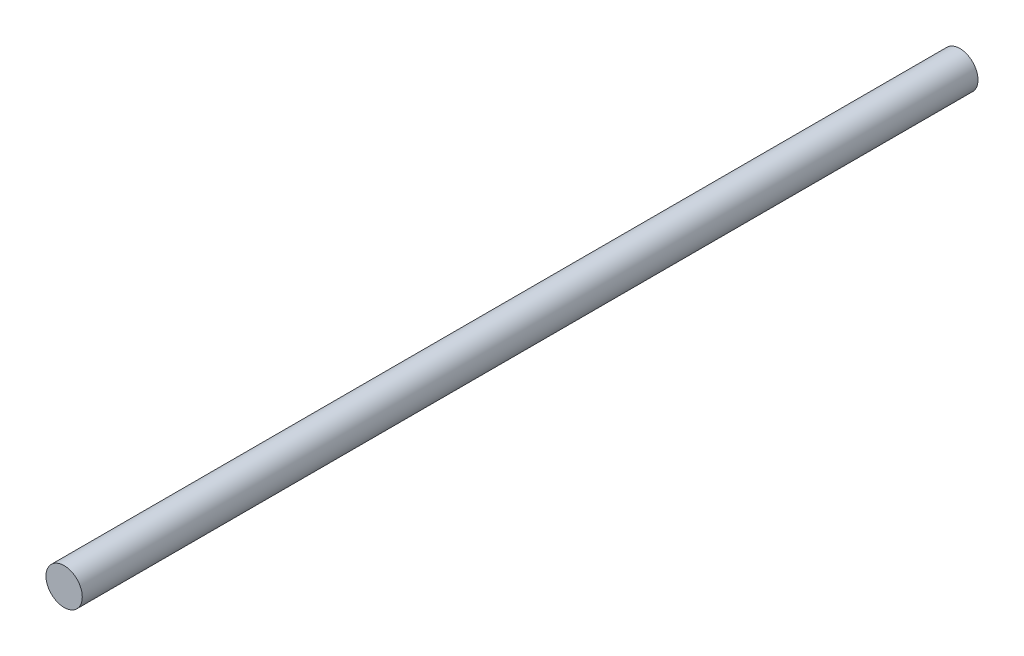
ISO-10303-21;
HEADER;
FILE_DESCRIPTION(('STEP AP214'),'2;1');
FILE_NAME('part.step','',(''),(''),'','','');
FILE_SCHEMA(('AUTOMOTIVE_DESIGN { 1 0 10303 214 1 1 1 1 }'));
ENDSEC;
DATA;
#1=APPLICATION_CONTEXT('core data for automotive mechanical design processes');
#2=APPLICATION_PROTOCOL_DEFINITION('international standard','automotive_design',2000,#1);
#3=PRODUCT_CONTEXT('',#1,'mechanical');
#4=PRODUCT('Part','Part','',(#3));
#5=PRODUCT_RELATED_PRODUCT_CATEGORY('part','',(#4));
#6=PRODUCT_DEFINITION_FORMATION('','',#4);
#7=PRODUCT_DEFINITION_CONTEXT('part definition',#1,'design');
#8=PRODUCT_DEFINITION('design','',#6,#7);
#9=PRODUCT_DEFINITION_SHAPE('','',#8);
#10=(LENGTH_UNIT() NAMED_UNIT(*) SI_UNIT(.MILLI.,.METRE.));
#11=(NAMED_UNIT(*) PLANE_ANGLE_UNIT() SI_UNIT($,.RADIAN.));
#12=(NAMED_UNIT(*) SI_UNIT($,.STERADIAN.) SOLID_ANGLE_UNIT());
#13=UNCERTAINTY_MEASURE_WITH_UNIT(LENGTH_MEASURE(1.E-05),#10,'distance_accuracy_value','');
#14=(GEOMETRIC_REPRESENTATION_CONTEXT(3) GLOBAL_UNCERTAINTY_ASSIGNED_CONTEXT((#13)) GLOBAL_UNIT_ASSIGNED_CONTEXT((#10,
#11,#12)) REPRESENTATION_CONTEXT('',''));
#15=CARTESIAN_POINT('',(0.,0.,0.));
#16=DIRECTION('',(0.,0.,1.));
#17=DIRECTION('',(1.,0.,0.));
#18=AXIS2_PLACEMENT_3D('',#15,#16,#17);
#19=CARTESIAN_POINT('',(0.,0.,74.));
#20=DIRECTION('',(0.,0.,-1.));
#21=DIRECTION('',(-1.,0.,0.));
#22=AXIS2_PLACEMENT_3D('',#19,#20,#21);
#23=CYLINDRICAL_SURFACE('',#22,1.5);
#24=CARTESIAN_POINT('',(0.,0.,74.));
#25=DIRECTION('',(0.,0.,1.));
#26=DIRECTION('',(1.,0.,0.));
#27=AXIS2_PLACEMENT_3D('',#24,#25,#26);
#28=CIRCLE('',#27,1.5);
#29=CARTESIAN_POINT('',(1.5,0.,74.));
#30=VERTEX_POINT('',#29);
#31=EDGE_CURVE('E10',#30,#30,#28,.T.);
#32=ORIENTED_EDGE('',*,*,#31,.F.);
#33=EDGE_LOOP('',(#32));
#34=FACE_BOUND('',#33,.T.);
#35=CARTESIAN_POINT('',(0.,0.,0.));
#36=DIRECTION('',(0.,0.,1.));
#37=DIRECTION('',(1.,0.,0.));
#38=AXIS2_PLACEMENT_3D('',#35,#36,#37);
#39=CIRCLE('',#38,1.5);
#40=CARTESIAN_POINT('',(1.5,0.,0.));
#41=VERTEX_POINT('',#40);
#42=EDGE_CURVE('E34',#41,#41,#39,.T.);
#43=ORIENTED_EDGE('',*,*,#42,.T.);
#44=EDGE_LOOP('',(#43));
#45=FACE_BOUND('',#44,.T.);
#46=ADVANCED_FACE('F31',(#34,#45),#23,.T.);
#47=CARTESIAN_POINT('',(0.,0.,74.));
#48=DIRECTION('',(0.,0.,1.));
#49=DIRECTION('',(1.,0.,0.));
#50=AXIS2_PLACEMENT_3D('',#47,#48,#49);
#51=PLANE('',#50);
#52=ORIENTED_EDGE('',*,*,#31,.T.);
#53=EDGE_LOOP('',(#52));
#54=FACE_BOUND('',#53,.T.);
#55=ADVANCED_FACE('F46',(#54),#51,.T.);
#56=CARTESIAN_POINT('',(0.,0.,0.));
#57=DIRECTION('',(0.,0.,1.));
#58=DIRECTION('',(1.,0.,0.));
#59=AXIS2_PLACEMENT_3D('',#56,#57,#58);
#60=PLANE('',#59);
#61=ORIENTED_EDGE('',*,*,#42,.F.);
#62=EDGE_LOOP('',(#61));
#63=FACE_BOUND('',#62,.T.);
#64=ADVANCED_FACE('F44',(#63),#60,.F.);
#65=CLOSED_SHELL('',(#46,#55,#64));
#66=MANIFOLD_SOLID_BREP('B2',#65);
#67=ADVANCED_BREP_SHAPE_REPRESENTATION('',(#18,#66),#14);
#68=SHAPE_DEFINITION_REPRESENTATION(#9,#67);
ENDSEC;
END-ISO-10303-21;
